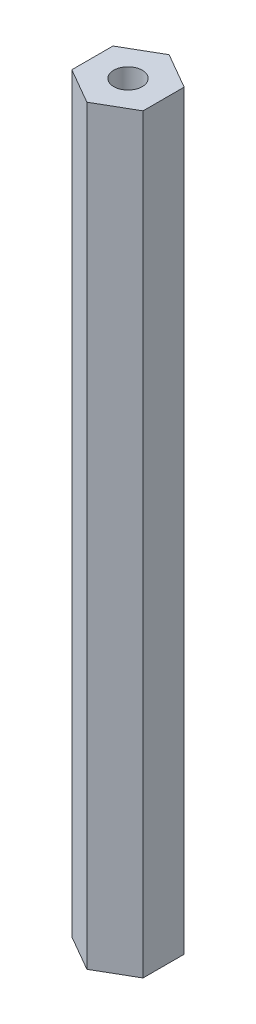
ISO-10303-21;
HEADER;
FILE_DESCRIPTION(('STEP AP214'),'2;1');
FILE_NAME('part.step','',(''),(''),'','','');
FILE_SCHEMA(('AUTOMOTIVE_DESIGN { 1 0 10303 214 1 1 1 1 }'));
ENDSEC;
DATA;
#1=APPLICATION_CONTEXT('core data for automotive mechanical design processes');
#2=APPLICATION_PROTOCOL_DEFINITION('international standard','automotive_design',2000,#1);
#3=PRODUCT_CONTEXT('',#1,'mechanical');
#4=PRODUCT('Part','Part','',(#3));
#5=PRODUCT_RELATED_PRODUCT_CATEGORY('part','',(#4));
#6=PRODUCT_DEFINITION_FORMATION('','',#4);
#7=PRODUCT_DEFINITION_CONTEXT('part definition',#1,'design');
#8=PRODUCT_DEFINITION('design','',#6,#7);
#9=PRODUCT_DEFINITION_SHAPE('','',#8);
#10=(LENGTH_UNIT() NAMED_UNIT(*) SI_UNIT(.MILLI.,.METRE.));
#11=(NAMED_UNIT(*) PLANE_ANGLE_UNIT() SI_UNIT($,.RADIAN.));
#12=(NAMED_UNIT(*) SI_UNIT($,.STERADIAN.) SOLID_ANGLE_UNIT());
#13=UNCERTAINTY_MEASURE_WITH_UNIT(LENGTH_MEASURE(1.E-05),#10,'distance_accuracy_value','');
#14=(GEOMETRIC_REPRESENTATION_CONTEXT(3) GLOBAL_UNCERTAINTY_ASSIGNED_CONTEXT((#13)) GLOBAL_UNIT_ASSIGNED_CONTEXT((#10,
#11,#12)) REPRESENTATION_CONTEXT('',''));
#15=CARTESIAN_POINT('',(0.,0.,0.));
#16=DIRECTION('',(0.,0.,1.));
#17=DIRECTION('',(1.,0.,0.));
#18=AXIS2_PLACEMENT_3D('',#15,#16,#17);
#19=CARTESIAN_POINT('',(0.,75.,0.));
#20=DIRECTION('',(0.,1.,0.));
#21=DIRECTION('',(0.,0.,1.));
#22=AXIS2_PLACEMENT_3D('',#19,#20,#21);
#23=PLANE('',#22);
#24=DIRECTION('',(-0.866025403784439,0.,-0.5));
#25=VECTOR('',#24,1.);
#26=CARTESIAN_POINT('',(3.55599999999999,75.,-2.05305755723831));
#27=LINE('',#26,#25);
#28=CARTESIAN_POINT('',(3.55599999999999,75.,-2.05305755723831));
#29=VERTEX_POINT('',#28);
#30=CARTESIAN_POINT('',(0.,75.,-4.10611511447662));
#31=VERTEX_POINT('',#30);
#32=EDGE_CURVE('E130',#29,#31,#27,.T.);
#33=ORIENTED_EDGE('',*,*,#32,.T.);
#34=DIRECTION('',(-0.866025403784439,0.,0.5));
#35=VECTOR('',#34,1.);
#36=CARTESIAN_POINT('',(0.,75.,-4.10611511447662));
#37=LINE('',#36,#35);
#38=CARTESIAN_POINT('',(-3.556,75.,-2.05305755723831));
#39=VERTEX_POINT('',#38);
#40=EDGE_CURVE('E88',#31,#39,#37,.T.);
#41=ORIENTED_EDGE('',*,*,#40,.T.);
#42=DIRECTION('',(0.,0.,1.));
#43=VECTOR('',#42,1.);
#44=CARTESIAN_POINT('',(-3.556,75.,-2.05305755723831));
#45=LINE('',#44,#43);
#46=CARTESIAN_POINT('',(-3.556,75.,2.05305755723831));
#47=VERTEX_POINT('',#46);
#48=EDGE_CURVE('E101',#39,#47,#45,.T.);
#49=ORIENTED_EDGE('',*,*,#48,.T.);
#50=DIRECTION('',(0.866025403784439,0.,0.5));
#51=VECTOR('',#50,1.);
#52=CARTESIAN_POINT('',(-3.556,75.,2.05305755723831));
#53=LINE('',#52,#51);
#54=CARTESIAN_POINT('',(0.,75.,4.10611511447662));
#55=VERTEX_POINT('',#54);
#56=EDGE_CURVE('E95',#47,#55,#53,.T.);
#57=ORIENTED_EDGE('',*,*,#56,.T.);
#58=DIRECTION('',(0.866025403784439,0.,-0.5));
#59=VECTOR('',#58,1.);
#60=CARTESIAN_POINT('',(0.,75.,4.10611511447662));
#61=LINE('',#60,#59);
#62=CARTESIAN_POINT('',(3.556,75.,2.05305755723831));
#63=VERTEX_POINT('',#62);
#64=EDGE_CURVE('E99',#55,#63,#61,.T.);
#65=ORIENTED_EDGE('',*,*,#64,.T.);
#66=DIRECTION('',(0.,0.,-1.));
#67=VECTOR('',#66,1.);
#68=CARTESIAN_POINT('',(3.556,75.,2.05305755723831));
#69=LINE('',#68,#67);
#70=EDGE_CURVE('E51',#63,#29,#69,.T.);
#71=ORIENTED_EDGE('',*,*,#70,.T.);
#72=EDGE_LOOP('',(#33,#41,#49,#57,#65,#71));
#73=FACE_BOUND('',#72,.T.);
#74=CARTESIAN_POINT('',(0.,75.,0.));
#75=DIRECTION('',(0.,1.,0.));
#76=DIRECTION('',(0.,0.,1.));
#77=AXIS2_PLACEMENT_3D('',#74,#75,#76);
#78=CIRCLE('',#77,1.42500000000001);
#79=CARTESIAN_POINT('',(0.,75.,1.42500000000001));
#80=VERTEX_POINT('',#79);
#81=EDGE_CURVE('E123',#80,#80,#78,.T.);
#82=ORIENTED_EDGE('',*,*,#81,.F.);
#83=EDGE_LOOP('',(#82));
#84=FACE_BOUND('',#83,.T.);
#85=ADVANCED_FACE('F34',(#73,#84),#23,.T.);
#86=CARTESIAN_POINT('',(0.,0.,0.));
#87=DIRECTION('',(0.,1.,0.));
#88=DIRECTION('',(0.,0.,1.));
#89=AXIS2_PLACEMENT_3D('',#86,#87,#88);
#90=PLANE('',#89);
#91=DIRECTION('',(-0.866025403784439,0.,-0.5));
#92=VECTOR('',#91,1.);
#93=CARTESIAN_POINT('',(3.55599999999999,0.,-2.05305755723831));
#94=LINE('',#93,#92);
#95=CARTESIAN_POINT('',(3.55599999999999,0.,-2.05305755723831));
#96=VERTEX_POINT('',#95);
#97=CARTESIAN_POINT('',(0.,0.,-4.10611511447662));
#98=VERTEX_POINT('',#97);
#99=EDGE_CURVE('E119',#96,#98,#94,.T.);
#100=ORIENTED_EDGE('',*,*,#99,.F.);
#101=DIRECTION('',(0.,0.,-1.));
#102=VECTOR('',#101,1.);
#103=CARTESIAN_POINT('',(3.556,0.,2.05305755723831));
#104=LINE('',#103,#102);
#105=CARTESIAN_POINT('',(3.556,0.,2.05305755723831));
#106=VERTEX_POINT('',#105);
#107=EDGE_CURVE('E80',#106,#96,#104,.T.);
#108=ORIENTED_EDGE('',*,*,#107,.F.);
#109=DIRECTION('',(0.866025403784439,0.,-0.5));
#110=VECTOR('',#109,1.);
#111=CARTESIAN_POINT('',(0.,0.,4.10611511447662));
#112=LINE('',#111,#110);
#113=CARTESIAN_POINT('',(0.,0.,4.10611511447662));
#114=VERTEX_POINT('',#113);
#115=EDGE_CURVE('E74',#114,#106,#112,.T.);
#116=ORIENTED_EDGE('',*,*,#115,.F.);
#117=DIRECTION('',(0.866025403784439,0.,0.5));
#118=VECTOR('',#117,1.);
#119=CARTESIAN_POINT('',(-3.556,0.,2.05305755723831));
#120=LINE('',#119,#118);
#121=CARTESIAN_POINT('',(-3.556,0.,2.05305755723831));
#122=VERTEX_POINT('',#121);
#123=EDGE_CURVE('E109',#122,#114,#120,.T.);
#124=ORIENTED_EDGE('',*,*,#123,.F.);
#125=DIRECTION('',(0.,0.,1.));
#126=VECTOR('',#125,1.);
#127=CARTESIAN_POINT('',(-3.556,0.,-2.05305755723831));
#128=LINE('',#127,#126);
#129=CARTESIAN_POINT('',(-3.556,0.,-2.05305755723831));
#130=VERTEX_POINT('',#129);
#131=EDGE_CURVE('E125',#130,#122,#128,.T.);
#132=ORIENTED_EDGE('',*,*,#131,.F.);
#133=DIRECTION('',(-0.866025403784439,0.,0.5));
#134=VECTOR('',#133,1.);
#135=CARTESIAN_POINT('',(0.,0.,-4.10611511447662));
#136=LINE('',#135,#134);
#137=EDGE_CURVE('E122',#98,#130,#136,.T.);
#138=ORIENTED_EDGE('',*,*,#137,.F.);
#139=EDGE_LOOP('',(#100,#108,#116,#124,#132,#138));
#140=FACE_BOUND('',#139,.T.);
#141=CARTESIAN_POINT('',(0.,0.,0.));
#142=DIRECTION('',(0.,1.,0.));
#143=DIRECTION('',(0.,0.,1.));
#144=AXIS2_PLACEMENT_3D('',#141,#142,#143);
#145=CIRCLE('',#144,1.42500000000001);
#146=CARTESIAN_POINT('',(0.,0.,1.42500000000001));
#147=VERTEX_POINT('',#146);
#148=EDGE_CURVE('E223',#147,#147,#145,.T.);
#149=ORIENTED_EDGE('',*,*,#148,.T.);
#150=EDGE_LOOP('',(#149));
#151=FACE_BOUND('',#150,.T.);
#152=ADVANCED_FACE('F139',(#140,#151),#90,.F.);
#153=CARTESIAN_POINT('',(3.55599999999999,75.,-2.05305755723831));
#154=DIRECTION('',(-0.5,0.,0.866025403784439));
#155=DIRECTION('',(0.866025403784439,0.,0.5));
#156=AXIS2_PLACEMENT_3D('',#153,#154,#155);
#157=PLANE('',#156);
#158=ORIENTED_EDGE('',*,*,#99,.T.);
#159=DIRECTION('',(0.,-1.,0.));
#160=VECTOR('',#159,1.);
#161=CARTESIAN_POINT('',(0.,75.,-4.10611511447662));
#162=LINE('',#161,#160);
#163=EDGE_CURVE('E11',#31,#98,#162,.T.);
#164=ORIENTED_EDGE('',*,*,#163,.F.);
#165=ORIENTED_EDGE('',*,*,#32,.F.);
#166=DIRECTION('',(0.,-1.,0.));
#167=VECTOR('',#166,1.);
#168=CARTESIAN_POINT('',(3.55599999999999,75.,-2.05305755723831));
#169=LINE('',#168,#167);
#170=EDGE_CURVE('E115',#29,#96,#169,.T.);
#171=ORIENTED_EDGE('',*,*,#170,.T.);
#172=EDGE_LOOP('',(#158,#164,#165,#171));
#173=FACE_BOUND('',#172,.T.);
#174=ADVANCED_FACE('F36',(#173),#157,.F.);
#175=CARTESIAN_POINT('',(0.,75.,-4.10611511447662));
#176=DIRECTION('',(0.5,0.,0.866025403784439));
#177=DIRECTION('',(0.866025403784439,0.,-0.5));
#178=AXIS2_PLACEMENT_3D('',#175,#176,#177);
#179=PLANE('',#178);
#180=ORIENTED_EDGE('',*,*,#137,.T.);
#181=DIRECTION('',(0.,-1.,0.));
#182=VECTOR('',#181,1.);
#183=CARTESIAN_POINT('',(-3.556,75.,-2.05305755723831));
#184=LINE('',#183,#182);
#185=EDGE_CURVE('E43',#39,#130,#184,.T.);
#186=ORIENTED_EDGE('',*,*,#185,.F.);
#187=ORIENTED_EDGE('',*,*,#40,.F.);
#188=ORIENTED_EDGE('',*,*,#163,.T.);
#189=EDGE_LOOP('',(#180,#186,#187,#188));
#190=FACE_BOUND('',#189,.T.);
#191=ADVANCED_FACE('F164',(#190),#179,.F.);
#192=CARTESIAN_POINT('',(-3.556,75.,-2.05305755723831));
#193=DIRECTION('',(1.,0.,0.));
#194=DIRECTION('',(0.,0.,-1.));
#195=AXIS2_PLACEMENT_3D('',#192,#193,#194);
#196=PLANE('',#195);
#197=ORIENTED_EDGE('',*,*,#131,.T.);
#198=DIRECTION('',(0.,-1.,0.));
#199=VECTOR('',#198,1.);
#200=CARTESIAN_POINT('',(-3.556,75.,2.05305755723831));
#201=LINE('',#200,#199);
#202=EDGE_CURVE('E110',#47,#122,#201,.T.);
#203=ORIENTED_EDGE('',*,*,#202,.F.);
#204=ORIENTED_EDGE('',*,*,#48,.F.);
#205=ORIENTED_EDGE('',*,*,#185,.T.);
#206=EDGE_LOOP('',(#197,#203,#204,#205));
#207=FACE_BOUND('',#206,.T.);
#208=ADVANCED_FACE('F136',(#207),#196,.F.);
#209=CARTESIAN_POINT('',(-3.556,75.,2.05305755723831));
#210=DIRECTION('',(0.5,0.,-0.866025403784439));
#211=DIRECTION('',(-0.866025403784439,0.,-0.5));
#212=AXIS2_PLACEMENT_3D('',#209,#210,#211);
#213=PLANE('',#212);
#214=ORIENTED_EDGE('',*,*,#123,.T.);
#215=DIRECTION('',(0.,-1.,0.));
#216=VECTOR('',#215,1.);
#217=CARTESIAN_POINT('',(0.,75.,4.10611511447662));
#218=LINE('',#217,#216);
#219=EDGE_CURVE('E106',#55,#114,#218,.T.);
#220=ORIENTED_EDGE('',*,*,#219,.F.);
#221=ORIENTED_EDGE('',*,*,#56,.F.);
#222=ORIENTED_EDGE('',*,*,#202,.T.);
#223=EDGE_LOOP('',(#214,#220,#221,#222));
#224=FACE_BOUND('',#223,.T.);
#225=ADVANCED_FACE('F107',(#224),#213,.F.);
#226=CARTESIAN_POINT('',(0.,75.,4.10611511447662));
#227=DIRECTION('',(-0.5,0.,-0.866025403784439));
#228=DIRECTION('',(-0.866025403784439,0.,0.5));
#229=AXIS2_PLACEMENT_3D('',#226,#227,#228);
#230=PLANE('',#229);
#231=ORIENTED_EDGE('',*,*,#115,.T.);
#232=DIRECTION('',(0.,-1.,0.));
#233=VECTOR('',#232,1.);
#234=CARTESIAN_POINT('',(3.556,75.,2.05305755723831));
#235=LINE('',#234,#233);
#236=EDGE_CURVE('E111',#63,#106,#235,.T.);
#237=ORIENTED_EDGE('',*,*,#236,.F.);
#238=ORIENTED_EDGE('',*,*,#64,.F.);
#239=ORIENTED_EDGE('',*,*,#219,.T.);
#240=EDGE_LOOP('',(#231,#237,#238,#239));
#241=FACE_BOUND('',#240,.T.);
#242=ADVANCED_FACE('F113',(#241),#230,.F.);
#243=CARTESIAN_POINT('',(3.556,75.,2.05305755723831));
#244=DIRECTION('',(-1.,0.,0.));
#245=DIRECTION('',(0.,0.,1.));
#246=AXIS2_PLACEMENT_3D('',#243,#244,#245);
#247=PLANE('',#246);
#248=ORIENTED_EDGE('',*,*,#107,.T.);
#249=ORIENTED_EDGE('',*,*,#170,.F.);
#250=ORIENTED_EDGE('',*,*,#70,.F.);
#251=ORIENTED_EDGE('',*,*,#236,.T.);
#252=EDGE_LOOP('',(#248,#249,#250,#251));
#253=FACE_BOUND('',#252,.T.);
#254=ADVANCED_FACE('F144',(#253),#247,.F.);
#255=CARTESIAN_POINT('',(0.,75.,0.));
#256=DIRECTION('',(0.,-1.,0.));
#257=DIRECTION('',(0.,0.,-1.));
#258=AXIS2_PLACEMENT_3D('',#255,#256,#257);
#259=CYLINDRICAL_SURFACE('',#258,1.42500000000001);
#260=ORIENTED_EDGE('',*,*,#81,.T.);
#261=EDGE_LOOP('',(#260));
#262=FACE_BOUND('',#261,.T.);
#263=ORIENTED_EDGE('',*,*,#148,.F.);
#264=EDGE_LOOP('',(#263));
#265=FACE_BOUND('',#264,.T.);
#266=ADVANCED_FACE('F146',(#262,#265),#259,.F.);
#267=CLOSED_SHELL('',(#85,#152,#174,#191,#208,#225,#242,#254,#266));
#268=MANIFOLD_SOLID_BREP('B2',#267);
#269=ADVANCED_BREP_SHAPE_REPRESENTATION('',(#18,#268),#14);
#270=SHAPE_DEFINITION_REPRESENTATION(#9,#269);
ENDSEC;
END-ISO-10303-21;
